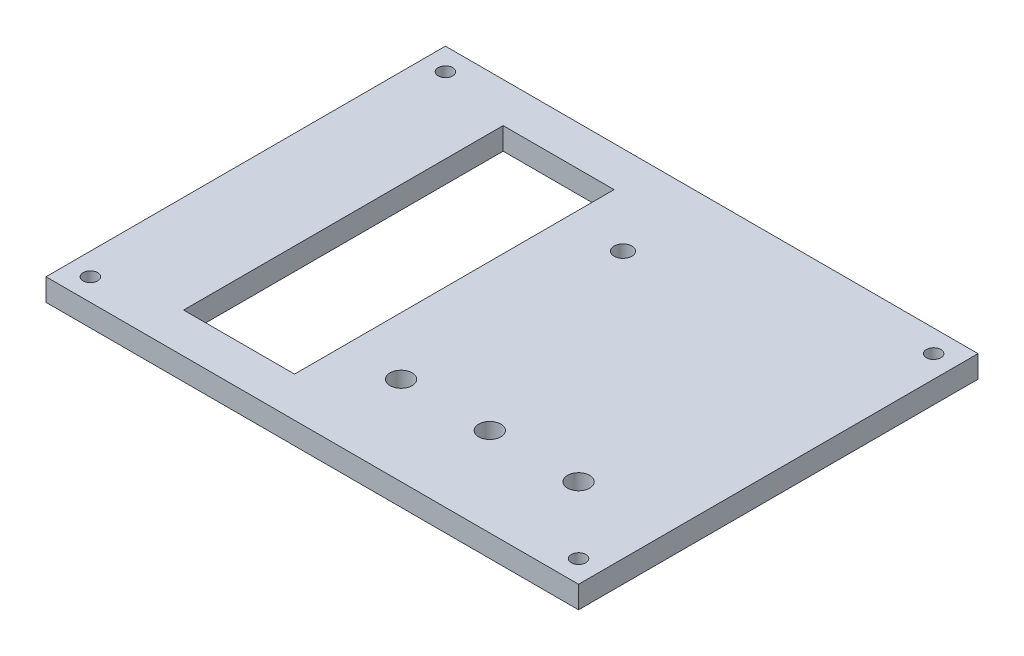
ISO-10303-21;
HEADER;
FILE_DESCRIPTION(('STEP AP214'),'2;1');
FILE_NAME('part.step','',(''),(''),'','','');
FILE_SCHEMA(('AUTOMOTIVE_DESIGN { 1 0 10303 214 1 1 1 1 }'));
ENDSEC;
DATA;
#1=APPLICATION_CONTEXT('core data for automotive mechanical design processes');
#2=APPLICATION_PROTOCOL_DEFINITION('international standard','automotive_design',2000,#1);
#3=PRODUCT_CONTEXT('',#1,'mechanical');
#4=PRODUCT('Part','Part','',(#3));
#5=PRODUCT_RELATED_PRODUCT_CATEGORY('part','',(#4));
#6=PRODUCT_DEFINITION_FORMATION('','',#4);
#7=PRODUCT_DEFINITION_CONTEXT('part definition',#1,'design');
#8=PRODUCT_DEFINITION('design','',#6,#7);
#9=PRODUCT_DEFINITION_SHAPE('','',#8);
#10=(LENGTH_UNIT() NAMED_UNIT(*) SI_UNIT(.MILLI.,.METRE.));
#11=(NAMED_UNIT(*) PLANE_ANGLE_UNIT() SI_UNIT($,.RADIAN.));
#12=(NAMED_UNIT(*) SI_UNIT($,.STERADIAN.) SOLID_ANGLE_UNIT());
#13=UNCERTAINTY_MEASURE_WITH_UNIT(LENGTH_MEASURE(1.E-05),#10,'distance_accuracy_value','');
#14=(GEOMETRIC_REPRESENTATION_CONTEXT(3) GLOBAL_UNCERTAINTY_ASSIGNED_CONTEXT((#13)) GLOBAL_UNIT_ASSIGNED_CONTEXT((#10,
#11,#12)) REPRESENTATION_CONTEXT('',''));
#15=CARTESIAN_POINT('',(0.,0.,0.));
#16=DIRECTION('',(0.,0.,1.));
#17=DIRECTION('',(1.,0.,0.));
#18=AXIS2_PLACEMENT_3D('',#15,#16,#17);
#19=CARTESIAN_POINT('',(60.,5.,45.));
#20=DIRECTION('',(-1.,0.,0.));
#21=DIRECTION('',(0.,0.,1.));
#22=AXIS2_PLACEMENT_3D('',#19,#20,#21);
#23=PLANE('',#22);
#24=DIRECTION('',(0.,0.,-1.));
#25=VECTOR('',#24,1.);
#26=CARTESIAN_POINT('',(60.,0.,45.));
#27=LINE('',#26,#25);
#28=CARTESIAN_POINT('',(60.,0.,45.));
#29=VERTEX_POINT('',#28);
#30=CARTESIAN_POINT('',(60.,0.,-45.));
#31=VERTEX_POINT('',#30);
#32=EDGE_CURVE('E182',#29,#31,#27,.T.);
#33=ORIENTED_EDGE('',*,*,#32,.T.);
#34=DIRECTION('',(0.,-1.,0.));
#35=VECTOR('',#34,1.);
#36=CARTESIAN_POINT('',(60.,5.,-45.));
#37=LINE('',#36,#35);
#38=CARTESIAN_POINT('',(60.,5.,-45.));
#39=VERTEX_POINT('',#38);
#40=EDGE_CURVE('E11',#39,#31,#37,.T.);
#41=ORIENTED_EDGE('',*,*,#40,.F.);
#42=DIRECTION('',(0.,0.,-1.));
#43=VECTOR('',#42,1.);
#44=CARTESIAN_POINT('',(60.,5.,45.));
#45=LINE('',#44,#43);
#46=CARTESIAN_POINT('',(60.,5.,45.));
#47=VERTEX_POINT('',#46);
#48=EDGE_CURVE('E183',#47,#39,#45,.T.);
#49=ORIENTED_EDGE('',*,*,#48,.F.);
#50=DIRECTION('',(0.,-1.,0.));
#51=VECTOR('',#50,1.);
#52=CARTESIAN_POINT('',(60.,5.,45.));
#53=LINE('',#52,#51);
#54=EDGE_CURVE('E193',#47,#29,#53,.T.);
#55=ORIENTED_EDGE('',*,*,#54,.T.);
#56=EDGE_LOOP('',(#33,#41,#49,#55));
#57=FACE_BOUND('',#56,.T.);
#58=ADVANCED_FACE('F35',(#57),#23,.F.);
#59=CARTESIAN_POINT('',(-60.,5.,-45.));
#60=DIRECTION('',(0.,0.,1.));
#61=DIRECTION('',(1.,0.,0.));
#62=AXIS2_PLACEMENT_3D('',#59,#60,#61);
#63=PLANE('',#62);
#64=DIRECTION('',(-1.,0.,0.));
#65=VECTOR('',#64,1.);
#66=CARTESIAN_POINT('',(-60.,0.,-45.));
#67=LINE('',#66,#65);
#68=CARTESIAN_POINT('',(-60.,0.,-45.));
#69=VERTEX_POINT('',#68);
#70=EDGE_CURVE('E196',#31,#69,#67,.T.);
#71=ORIENTED_EDGE('',*,*,#70,.T.);
#72=DIRECTION('',(0.,-1.,0.));
#73=VECTOR('',#72,1.);
#74=CARTESIAN_POINT('',(-60.,5.,-45.));
#75=LINE('',#74,#73);
#76=CARTESIAN_POINT('',(-60.,5.,-45.));
#77=VERTEX_POINT('',#76);
#78=EDGE_CURVE('E42',#77,#69,#75,.T.);
#79=ORIENTED_EDGE('',*,*,#78,.F.);
#80=DIRECTION('',(-1.,0.,0.));
#81=VECTOR('',#80,1.);
#82=CARTESIAN_POINT('',(-60.,5.,-45.));
#83=LINE('',#82,#81);
#84=EDGE_CURVE('E186',#39,#77,#83,.T.);
#85=ORIENTED_EDGE('',*,*,#84,.F.);
#86=ORIENTED_EDGE('',*,*,#40,.T.);
#87=EDGE_LOOP('',(#71,#79,#85,#86));
#88=FACE_BOUND('',#87,.T.);
#89=ADVANCED_FACE('F225',(#88),#63,.F.);
#90=CARTESIAN_POINT('',(-60.,5.,45.));
#91=DIRECTION('',(1.,0.,0.));
#92=DIRECTION('',(0.,0.,-1.));
#93=AXIS2_PLACEMENT_3D('',#90,#91,#92);
#94=PLANE('',#93);
#95=DIRECTION('',(0.,0.,1.));
#96=VECTOR('',#95,1.);
#97=CARTESIAN_POINT('',(-60.,0.,45.));
#98=LINE('',#97,#96);
#99=CARTESIAN_POINT('',(-60.,0.,45.));
#100=VERTEX_POINT('',#99);
#101=EDGE_CURVE('E198',#69,#100,#98,.T.);
#102=ORIENTED_EDGE('',*,*,#101,.T.);
#103=DIRECTION('',(0.,-1.,0.));
#104=VECTOR('',#103,1.);
#105=CARTESIAN_POINT('',(-60.,5.,45.));
#106=LINE('',#105,#104);
#107=CARTESIAN_POINT('',(-60.,5.,45.));
#108=VERTEX_POINT('',#107);
#109=EDGE_CURVE('E203',#108,#100,#106,.T.);
#110=ORIENTED_EDGE('',*,*,#109,.F.);
#111=DIRECTION('',(0.,0.,1.));
#112=VECTOR('',#111,1.);
#113=CARTESIAN_POINT('',(-60.,5.,45.));
#114=LINE('',#113,#112);
#115=EDGE_CURVE('E189',#77,#108,#114,.T.);
#116=ORIENTED_EDGE('',*,*,#115,.F.);
#117=ORIENTED_EDGE('',*,*,#78,.T.);
#118=EDGE_LOOP('',(#102,#110,#116,#117));
#119=FACE_BOUND('',#118,.T.);
#120=ADVANCED_FACE('F210',(#119),#94,.F.);
#121=CARTESIAN_POINT('',(-60.,5.,45.));
#122=DIRECTION('',(0.,0.,-1.));
#123=DIRECTION('',(-1.,0.,0.));
#124=AXIS2_PLACEMENT_3D('',#121,#122,#123);
#125=PLANE('',#124);
#126=DIRECTION('',(1.,0.,0.));
#127=VECTOR('',#126,1.);
#128=CARTESIAN_POINT('',(-60.,0.,45.));
#129=LINE('',#128,#127);
#130=EDGE_CURVE('E187',#100,#29,#129,.T.);
#131=ORIENTED_EDGE('',*,*,#130,.T.);
#132=ORIENTED_EDGE('',*,*,#54,.F.);
#133=DIRECTION('',(1.,0.,0.));
#134=VECTOR('',#133,1.);
#135=CARTESIAN_POINT('',(-60.,5.,45.));
#136=LINE('',#135,#134);
#137=EDGE_CURVE('E191',#108,#47,#136,.T.);
#138=ORIENTED_EDGE('',*,*,#137,.F.);
#139=ORIENTED_EDGE('',*,*,#109,.T.);
#140=EDGE_LOOP('',(#131,#132,#138,#139));
#141=FACE_BOUND('',#140,.T.);
#142=ADVANCED_FACE('F218',(#141),#125,.F.);
#143=CARTESIAN_POINT('',(0.,5.,0.));
#144=DIRECTION('',(0.,-1.,0.));
#145=DIRECTION('',(0.,0.,-1.));
#146=AXIS2_PLACEMENT_3D('',#143,#144,#145);
#147=PLANE('',#146);
#148=CARTESIAN_POINT('',(0.,5.,-25.));
#149=DIRECTION('',(0.,1.,0.));
#150=DIRECTION('',(0.,0.,1.));
#151=AXIS2_PLACEMENT_3D('',#148,#149,#150);
#152=CIRCLE('',#151,2.);
#153=CARTESIAN_POINT('',(0.,5.,-23.));
#154=VERTEX_POINT('',#153);
#155=EDGE_CURVE('E304',#154,#154,#152,.T.);
#156=ORIENTED_EDGE('',*,*,#155,.F.);
#157=EDGE_LOOP('',(#156));
#158=FACE_BOUND('',#157,.T.);
#159=DIRECTION('',(1.,0.,0.));
#160=VECTOR('',#159,1.);
#161=CARTESIAN_POINT('',(-38.,5.,36.));
#162=LINE('',#161,#160);
#163=CARTESIAN_POINT('',(-38.,5.,36.));
#164=VERTEX_POINT('',#163);
#165=CARTESIAN_POINT('',(-13.,5.,36.));
#166=VERTEX_POINT('',#165);
#167=EDGE_CURVE('E129',#164,#166,#162,.T.);
#168=ORIENTED_EDGE('',*,*,#167,.F.);
#169=DIRECTION('',(0.,0.,1.));
#170=VECTOR('',#169,1.);
#171=CARTESIAN_POINT('',(-38.,5.,-36.));
#172=LINE('',#171,#170);
#173=CARTESIAN_POINT('',(-38.,5.,-36.));
#174=VERTEX_POINT('',#173);
#175=EDGE_CURVE('E49',#174,#164,#172,.T.);
#176=ORIENTED_EDGE('',*,*,#175,.F.);
#177=DIRECTION('',(-1.,0.,0.));
#178=VECTOR('',#177,1.);
#179=CARTESIAN_POINT('',(-38.,5.,-36.));
#180=LINE('',#179,#178);
#181=CARTESIAN_POINT('',(-13.,5.,-36.));
#182=VERTEX_POINT('',#181);
#183=EDGE_CURVE('E117',#182,#174,#180,.T.);
#184=ORIENTED_EDGE('',*,*,#183,.F.);
#185=DIRECTION('',(0.,0.,-1.));
#186=VECTOR('',#185,1.);
#187=CARTESIAN_POINT('',(-13.,5.,-36.));
#188=LINE('',#187,#186);
#189=EDGE_CURVE('E120',#166,#182,#188,.T.);
#190=ORIENTED_EDGE('',*,*,#189,.F.);
#191=EDGE_LOOP('',(#168,#176,#184,#190));
#192=FACE_BOUND('',#191,.T.);
#193=CARTESIAN_POINT('',(40.,5.,25.));
#194=DIRECTION('',(0.,1.,0.));
#195=DIRECTION('',(0.,0.,1.));
#196=AXIS2_PLACEMENT_3D('',#193,#194,#195);
#197=CIRCLE('',#196,2.5);
#198=CARTESIAN_POINT('',(40.,5.,27.5));
#199=VERTEX_POINT('',#198);
#200=EDGE_CURVE('E123',#199,#199,#197,.T.);
#201=ORIENTED_EDGE('',*,*,#200,.F.);
#202=EDGE_LOOP('',(#201));
#203=FACE_BOUND('',#202,.T.);
#204=CARTESIAN_POINT('',(20.,5.,25.));
#205=DIRECTION('',(0.,1.,0.));
#206=DIRECTION('',(0.,0.,1.));
#207=AXIS2_PLACEMENT_3D('',#204,#205,#206);
#208=CIRCLE('',#207,2.5);
#209=CARTESIAN_POINT('',(20.,5.,27.5));
#210=VERTEX_POINT('',#209);
#211=EDGE_CURVE('E312',#210,#210,#208,.T.);
#212=ORIENTED_EDGE('',*,*,#211,.F.);
#213=EDGE_LOOP('',(#212));
#214=FACE_BOUND('',#213,.T.);
#215=CARTESIAN_POINT('',(0.,5.,25.));
#216=DIRECTION('',(0.,1.,0.));
#217=DIRECTION('',(0.,0.,1.));
#218=AXIS2_PLACEMENT_3D('',#215,#216,#217);
#219=CIRCLE('',#218,2.5);
#220=CARTESIAN_POINT('',(0.,5.,27.5));
#221=VERTEX_POINT('',#220);
#222=EDGE_CURVE('E143',#221,#221,#219,.T.);
#223=ORIENTED_EDGE('',*,*,#222,.F.);
#224=EDGE_LOOP('',(#223));
#225=FACE_BOUND('',#224,.T.);
#226=CARTESIAN_POINT('',(55.,5.,-40.));
#227=DIRECTION('',(0.,-1.,0.));
#228=DIRECTION('',(0.,0.,-1.));
#229=AXIS2_PLACEMENT_3D('',#226,#227,#228);
#230=CIRCLE('',#229,1.63195);
#231=CARTESIAN_POINT('',(55.,5.,-41.63195));
#232=VERTEX_POINT('',#231);
#233=EDGE_CURVE('E152',#232,#232,#230,.T.);
#234=ORIENTED_EDGE('',*,*,#233,.T.);
#235=EDGE_LOOP('',(#234));
#236=FACE_BOUND('',#235,.T.);
#237=CARTESIAN_POINT('',(55.,5.,40.));
#238=DIRECTION('',(0.,-1.,0.));
#239=DIRECTION('',(0.,0.,-1.));
#240=AXIS2_PLACEMENT_3D('',#237,#238,#239);
#241=CIRCLE('',#240,1.63195);
#242=CARTESIAN_POINT('',(55.,5.,38.36805));
#243=VERTEX_POINT('',#242);
#244=EDGE_CURVE('E161',#243,#243,#241,.T.);
#245=ORIENTED_EDGE('',*,*,#244,.T.);
#246=EDGE_LOOP('',(#245));
#247=FACE_BOUND('',#246,.T.);
#248=CARTESIAN_POINT('',(-55.,5.,40.));
#249=DIRECTION('',(0.,-1.,0.));
#250=DIRECTION('',(0.,0.,-1.));
#251=AXIS2_PLACEMENT_3D('',#248,#249,#250);
#252=CIRCLE('',#251,1.63195);
#253=CARTESIAN_POINT('',(-55.,5.,38.36805));
#254=VERTEX_POINT('',#253);
#255=EDGE_CURVE('E170',#254,#254,#252,.T.);
#256=ORIENTED_EDGE('',*,*,#255,.T.);
#257=EDGE_LOOP('',(#256));
#258=FACE_BOUND('',#257,.T.);
#259=CARTESIAN_POINT('',(-55.,5.,-40.));
#260=DIRECTION('',(0.,-1.,0.));
#261=DIRECTION('',(0.,0.,-1.));
#262=AXIS2_PLACEMENT_3D('',#259,#260,#261);
#263=CIRCLE('',#262,1.63195);
#264=CARTESIAN_POINT('',(-55.,5.,-41.63195));
#265=VERTEX_POINT('',#264);
#266=EDGE_CURVE('E179',#265,#265,#263,.T.);
#267=ORIENTED_EDGE('',*,*,#266,.T.);
#268=EDGE_LOOP('',(#267));
#269=FACE_BOUND('',#268,.T.);
#270=ORIENTED_EDGE('',*,*,#48,.T.);
#271=ORIENTED_EDGE('',*,*,#84,.T.);
#272=ORIENTED_EDGE('',*,*,#115,.T.);
#273=ORIENTED_EDGE('',*,*,#137,.T.);
#274=EDGE_LOOP('',(#270,#271,#272,#273));
#275=FACE_BOUND('',#274,.T.);
#276=ADVANCED_FACE('F224',(#158,#192,#203,#214,#225,#236,#247,#258,#269,#275),#147,.F.);
#277=CARTESIAN_POINT('',(0.,0.,0.));
#278=DIRECTION('',(0.,-1.,0.));
#279=DIRECTION('',(0.,0.,-1.));
#280=AXIS2_PLACEMENT_3D('',#277,#278,#279);
#281=PLANE('',#280);
#282=CARTESIAN_POINT('',(0.,0.,-25.));
#283=DIRECTION('',(0.,-1.,0.));
#284=DIRECTION('',(0.,0.,-1.));
#285=AXIS2_PLACEMENT_3D('',#282,#283,#284);
#286=CIRCLE('',#285,2.);
#287=CARTESIAN_POINT('',(0.,0.,-27.));
#288=VERTEX_POINT('',#287);
#289=EDGE_CURVE('E130',#288,#288,#286,.F.);
#290=ORIENTED_EDGE('',*,*,#289,.T.);
#291=EDGE_LOOP('',(#290));
#292=FACE_BOUND('',#291,.T.);
#293=DIRECTION('',(0.,0.,1.));
#294=VECTOR('',#293,1.);
#295=CARTESIAN_POINT('',(-38.,0.,-36.));
#296=LINE('',#295,#294);
#297=CARTESIAN_POINT('',(-38.,0.,-36.));
#298=VERTEX_POINT('',#297);
#299=CARTESIAN_POINT('',(-38.,0.,36.));
#300=VERTEX_POINT('',#299);
#301=EDGE_CURVE('E101',#298,#300,#296,.T.);
#302=ORIENTED_EDGE('',*,*,#301,.T.);
#303=DIRECTION('',(1.,0.,0.));
#304=VECTOR('',#303,1.);
#305=CARTESIAN_POINT('',(-38.,0.,36.));
#306=LINE('',#305,#304);
#307=CARTESIAN_POINT('',(-13.,0.,36.));
#308=VERTEX_POINT('',#307);
#309=EDGE_CURVE('E110',#300,#308,#306,.T.);
#310=ORIENTED_EDGE('',*,*,#309,.T.);
#311=DIRECTION('',(0.,0.,-1.));
#312=VECTOR('',#311,1.);
#313=CARTESIAN_POINT('',(-13.,0.,-36.));
#314=LINE('',#313,#312);
#315=CARTESIAN_POINT('',(-13.,0.,-36.));
#316=VERTEX_POINT('',#315);
#317=EDGE_CURVE('E57',#308,#316,#314,.T.);
#318=ORIENTED_EDGE('',*,*,#317,.T.);
#319=DIRECTION('',(-1.,0.,0.));
#320=VECTOR('',#319,1.);
#321=CARTESIAN_POINT('',(-38.,0.,-36.));
#322=LINE('',#321,#320);
#323=EDGE_CURVE('E107',#316,#298,#322,.T.);
#324=ORIENTED_EDGE('',*,*,#323,.T.);
#325=EDGE_LOOP('',(#302,#310,#318,#324));
#326=FACE_BOUND('',#325,.T.);
#327=CARTESIAN_POINT('',(40.,0.,25.));
#328=DIRECTION('',(0.,1.,0.));
#329=DIRECTION('',(0.,0.,1.));
#330=AXIS2_PLACEMENT_3D('',#327,#328,#329);
#331=CIRCLE('',#330,2.5);
#332=CARTESIAN_POINT('',(40.,0.,27.5));
#333=VERTEX_POINT('',#332);
#334=EDGE_CURVE('E314',#333,#333,#331,.T.);
#335=ORIENTED_EDGE('',*,*,#334,.T.);
#336=EDGE_LOOP('',(#335));
#337=FACE_BOUND('',#336,.T.);
#338=CARTESIAN_POINT('',(20.,0.,25.));
#339=DIRECTION('',(0.,1.,0.));
#340=DIRECTION('',(0.,0.,1.));
#341=AXIS2_PLACEMENT_3D('',#338,#339,#340);
#342=CIRCLE('',#341,2.5);
#343=CARTESIAN_POINT('',(20.,0.,27.5));
#344=VERTEX_POINT('',#343);
#345=EDGE_CURVE('E146',#344,#344,#342,.T.);
#346=ORIENTED_EDGE('',*,*,#345,.T.);
#347=EDGE_LOOP('',(#346));
#348=FACE_BOUND('',#347,.T.);
#349=CARTESIAN_POINT('',(0.,0.,25.));
#350=DIRECTION('',(0.,1.,0.));
#351=DIRECTION('',(0.,0.,1.));
#352=AXIS2_PLACEMENT_3D('',#349,#350,#351);
#353=CIRCLE('',#352,2.5);
#354=CARTESIAN_POINT('',(0.,0.,27.5));
#355=VERTEX_POINT('',#354);
#356=EDGE_CURVE('E139',#355,#355,#353,.T.);
#357=ORIENTED_EDGE('',*,*,#356,.T.);
#358=EDGE_LOOP('',(#357));
#359=FACE_BOUND('',#358,.T.);
#360=CARTESIAN_POINT('',(55.,0.,-40.));
#361=DIRECTION('',(0.,-1.,0.));
#362=DIRECTION('',(0.,0.,-1.));
#363=AXIS2_PLACEMENT_3D('',#360,#361,#362);
#364=CIRCLE('',#363,2.8575);
#365=CARTESIAN_POINT('',(55.,0.,-42.8575));
#366=VERTEX_POINT('',#365);
#367=EDGE_CURVE('E142',#366,#366,#364,.T.);
#368=ORIENTED_EDGE('',*,*,#367,.F.);
#369=EDGE_LOOP('',(#368));
#370=FACE_BOUND('',#369,.T.);
#371=CARTESIAN_POINT('',(55.,0.,40.));
#372=DIRECTION('',(0.,-1.,0.));
#373=DIRECTION('',(0.,0.,-1.));
#374=AXIS2_PLACEMENT_3D('',#371,#372,#373);
#375=CIRCLE('',#374,2.8575);
#376=CARTESIAN_POINT('',(55.,0.,37.1425));
#377=VERTEX_POINT('',#376);
#378=EDGE_CURVE('E155',#377,#377,#375,.T.);
#379=ORIENTED_EDGE('',*,*,#378,.F.);
#380=EDGE_LOOP('',(#379));
#381=FACE_BOUND('',#380,.T.);
#382=CARTESIAN_POINT('',(-55.,0.,40.));
#383=DIRECTION('',(0.,-1.,0.));
#384=DIRECTION('',(0.,0.,-1.));
#385=AXIS2_PLACEMENT_3D('',#382,#383,#384);
#386=CIRCLE('',#385,2.8575);
#387=CARTESIAN_POINT('',(-55.,0.,37.1425));
#388=VERTEX_POINT('',#387);
#389=EDGE_CURVE('E164',#388,#388,#386,.T.);
#390=ORIENTED_EDGE('',*,*,#389,.F.);
#391=EDGE_LOOP('',(#390));
#392=FACE_BOUND('',#391,.T.);
#393=CARTESIAN_POINT('',(-55.,0.,-40.));
#394=DIRECTION('',(0.,-1.,0.));
#395=DIRECTION('',(0.,0.,-1.));
#396=AXIS2_PLACEMENT_3D('',#393,#394,#395);
#397=CIRCLE('',#396,2.8575);
#398=CARTESIAN_POINT('',(-55.,0.,-42.8575));
#399=VERTEX_POINT('',#398);
#400=EDGE_CURVE('E173',#399,#399,#397,.T.);
#401=ORIENTED_EDGE('',*,*,#400,.F.);
#402=EDGE_LOOP('',(#401));
#403=FACE_BOUND('',#402,.T.);
#404=ORIENTED_EDGE('',*,*,#32,.F.);
#405=ORIENTED_EDGE('',*,*,#130,.F.);
#406=ORIENTED_EDGE('',*,*,#101,.F.);
#407=ORIENTED_EDGE('',*,*,#70,.F.);
#408=EDGE_LOOP('',(#404,#405,#406,#407));
#409=FACE_BOUND('',#408,.T.);
#410=ADVANCED_FACE('F114',(#292,#326,#337,#348,#359,#370,#381,#392,#403,#409),#281,.T.);
#411=CARTESIAN_POINT('',(-55.,0.,-40.));
#412=DIRECTION('',(0.,-1.,0.));
#413=DIRECTION('',(0.,0.,-1.));
#414=AXIS2_PLACEMENT_3D('',#411,#412,#413);
#415=CYLINDRICAL_SURFACE('',#414,1.63195);
#416=ORIENTED_EDGE('',*,*,#266,.F.);
#417=EDGE_LOOP('',(#416));
#418=FACE_BOUND('',#417,.T.);
#419=CARTESIAN_POINT('',(-55.,1.40983400146971,-40.));
#420=DIRECTION('',(0.,-1.,0.));
#421=DIRECTION('',(0.,0.,-1.));
#422=AXIS2_PLACEMENT_3D('',#419,#420,#421);
#423=CIRCLE('',#422,1.63195);
#424=CARTESIAN_POINT('',(-55.,1.40983400146971,-41.63195));
#425=VERTEX_POINT('',#424);
#426=EDGE_CURVE('E176',#425,#425,#423,.T.);
#427=ORIENTED_EDGE('',*,*,#426,.T.);
#428=EDGE_LOOP('',(#427));
#429=FACE_BOUND('',#428,.T.);
#430=ADVANCED_FACE('F237',(#418,#429),#415,.F.);
#431=CARTESIAN_POINT('',(-55.,0.,-40.));
#432=DIRECTION('',(0.,-1.,0.));
#433=DIRECTION('',(0.,0.,-1.));
#434=AXIS2_PLACEMENT_3D('',#431,#432,#433);
#435=CONICAL_SURFACE('',#434,2.8575,0.715584993317673);
#436=ORIENTED_EDGE('',*,*,#426,.F.);
#437=EDGE_LOOP('',(#436));
#438=FACE_BOUND('',#437,.T.);
#439=ORIENTED_EDGE('',*,*,#400,.T.);
#440=EDGE_LOOP('',(#439));
#441=FACE_BOUND('',#440,.T.);
#442=ADVANCED_FACE('F244',(#438,#441),#435,.F.);
#443=CARTESIAN_POINT('',(-55.,0.,40.));
#444=DIRECTION('',(0.,-1.,0.));
#445=DIRECTION('',(0.,0.,-1.));
#446=AXIS2_PLACEMENT_3D('',#443,#444,#445);
#447=CYLINDRICAL_SURFACE('',#446,1.63195);
#448=ORIENTED_EDGE('',*,*,#255,.F.);
#449=EDGE_LOOP('',(#448));
#450=FACE_BOUND('',#449,.T.);
#451=CARTESIAN_POINT('',(-55.,1.40983400146971,40.));
#452=DIRECTION('',(0.,-1.,0.));
#453=DIRECTION('',(0.,0.,-1.));
#454=AXIS2_PLACEMENT_3D('',#451,#452,#453);
#455=CIRCLE('',#454,1.63195);
#456=CARTESIAN_POINT('',(-55.,1.40983400146971,38.36805));
#457=VERTEX_POINT('',#456);
#458=EDGE_CURVE('E167',#457,#457,#455,.T.);
#459=ORIENTED_EDGE('',*,*,#458,.T.);
#460=EDGE_LOOP('',(#459));
#461=FACE_BOUND('',#460,.T.);
#462=ADVANCED_FACE('F248',(#450,#461),#447,.F.);
#463=CARTESIAN_POINT('',(-55.,0.,40.));
#464=DIRECTION('',(0.,-1.,0.));
#465=DIRECTION('',(0.,0.,-1.));
#466=AXIS2_PLACEMENT_3D('',#463,#464,#465);
#467=CONICAL_SURFACE('',#466,2.8575,0.715584993317673);
#468=ORIENTED_EDGE('',*,*,#458,.F.);
#469=EDGE_LOOP('',(#468));
#470=FACE_BOUND('',#469,.T.);
#471=ORIENTED_EDGE('',*,*,#389,.T.);
#472=EDGE_LOOP('',(#471));
#473=FACE_BOUND('',#472,.T.);
#474=ADVANCED_FACE('F252',(#470,#473),#467,.F.);
#475=CARTESIAN_POINT('',(55.,0.,40.));
#476=DIRECTION('',(0.,-1.,0.));
#477=DIRECTION('',(0.,0.,-1.));
#478=AXIS2_PLACEMENT_3D('',#475,#476,#477);
#479=CYLINDRICAL_SURFACE('',#478,1.63195);
#480=ORIENTED_EDGE('',*,*,#244,.F.);
#481=EDGE_LOOP('',(#480));
#482=FACE_BOUND('',#481,.T.);
#483=CARTESIAN_POINT('',(55.,1.40983400146971,40.));
#484=DIRECTION('',(0.,-1.,0.));
#485=DIRECTION('',(0.,0.,-1.));
#486=AXIS2_PLACEMENT_3D('',#483,#484,#485);
#487=CIRCLE('',#486,1.63195);
#488=CARTESIAN_POINT('',(55.,1.40983400146971,38.36805));
#489=VERTEX_POINT('',#488);
#490=EDGE_CURVE('E158',#489,#489,#487,.T.);
#491=ORIENTED_EDGE('',*,*,#490,.T.);
#492=EDGE_LOOP('',(#491));
#493=FACE_BOUND('',#492,.T.);
#494=ADVANCED_FACE('F256',(#482,#493),#479,.F.);
#495=CARTESIAN_POINT('',(55.,0.,40.));
#496=DIRECTION('',(0.,-1.,0.));
#497=DIRECTION('',(0.,0.,-1.));
#498=AXIS2_PLACEMENT_3D('',#495,#496,#497);
#499=CONICAL_SURFACE('',#498,2.8575,0.715584993317673);
#500=ORIENTED_EDGE('',*,*,#490,.F.);
#501=EDGE_LOOP('',(#500));
#502=FACE_BOUND('',#501,.T.);
#503=ORIENTED_EDGE('',*,*,#378,.T.);
#504=EDGE_LOOP('',(#503));
#505=FACE_BOUND('',#504,.T.);
#506=ADVANCED_FACE('F260',(#502,#505),#499,.F.);
#507=CARTESIAN_POINT('',(55.,0.,-40.));
#508=DIRECTION('',(0.,-1.,0.));
#509=DIRECTION('',(0.,0.,-1.));
#510=AXIS2_PLACEMENT_3D('',#507,#508,#509);
#511=CYLINDRICAL_SURFACE('',#510,1.63195);
#512=ORIENTED_EDGE('',*,*,#233,.F.);
#513=EDGE_LOOP('',(#512));
#514=FACE_BOUND('',#513,.T.);
#515=CARTESIAN_POINT('',(55.,1.40983400146971,-40.));
#516=DIRECTION('',(0.,-1.,0.));
#517=DIRECTION('',(0.,0.,-1.));
#518=AXIS2_PLACEMENT_3D('',#515,#516,#517);
#519=CIRCLE('',#518,1.63195);
#520=CARTESIAN_POINT('',(55.,1.40983400146971,-41.63195));
#521=VERTEX_POINT('',#520);
#522=EDGE_CURVE('E149',#521,#521,#519,.T.);
#523=ORIENTED_EDGE('',*,*,#522,.T.);
#524=EDGE_LOOP('',(#523));
#525=FACE_BOUND('',#524,.T.);
#526=ADVANCED_FACE('F264',(#514,#525),#511,.F.);
#527=CARTESIAN_POINT('',(55.,0.,-40.));
#528=DIRECTION('',(0.,-1.,0.));
#529=DIRECTION('',(0.,0.,-1.));
#530=AXIS2_PLACEMENT_3D('',#527,#528,#529);
#531=CONICAL_SURFACE('',#530,2.8575,0.715584993317673);
#532=ORIENTED_EDGE('',*,*,#522,.F.);
#533=EDGE_LOOP('',(#532));
#534=FACE_BOUND('',#533,.T.);
#535=ORIENTED_EDGE('',*,*,#367,.T.);
#536=EDGE_LOOP('',(#535));
#537=FACE_BOUND('',#536,.T.);
#538=ADVANCED_FACE('F268',(#534,#537),#531,.F.);
#539=CARTESIAN_POINT('',(0.,0.,25.));
#540=DIRECTION('',(0.,1.,0.));
#541=DIRECTION('',(0.,0.,1.));
#542=AXIS2_PLACEMENT_3D('',#539,#540,#541);
#543=CYLINDRICAL_SURFACE('',#542,2.5);
#544=ORIENTED_EDGE('',*,*,#356,.F.);
#545=EDGE_LOOP('',(#544));
#546=FACE_BOUND('',#545,.T.);
#547=ORIENTED_EDGE('',*,*,#222,.T.);
#548=EDGE_LOOP('',(#547));
#549=FACE_BOUND('',#548,.T.);
#550=ADVANCED_FACE('F272',(#546,#549),#543,.F.);
#551=CARTESIAN_POINT('',(20.,0.,25.));
#552=DIRECTION('',(0.,1.,0.));
#553=DIRECTION('',(0.,0.,1.));
#554=AXIS2_PLACEMENT_3D('',#551,#552,#553);
#555=CYLINDRICAL_SURFACE('',#554,2.5);
#556=ORIENTED_EDGE('',*,*,#345,.F.);
#557=EDGE_LOOP('',(#556));
#558=FACE_BOUND('',#557,.T.);
#559=ORIENTED_EDGE('',*,*,#211,.T.);
#560=EDGE_LOOP('',(#559));
#561=FACE_BOUND('',#560,.T.);
#562=ADVANCED_FACE('F276',(#558,#561),#555,.F.);
#563=CARTESIAN_POINT('',(40.,0.,25.));
#564=DIRECTION('',(0.,1.,0.));
#565=DIRECTION('',(0.,0.,1.));
#566=AXIS2_PLACEMENT_3D('',#563,#564,#565);
#567=CYLINDRICAL_SURFACE('',#566,2.5);
#568=ORIENTED_EDGE('',*,*,#334,.F.);
#569=EDGE_LOOP('',(#568));
#570=FACE_BOUND('',#569,.T.);
#571=ORIENTED_EDGE('',*,*,#200,.T.);
#572=EDGE_LOOP('',(#571));
#573=FACE_BOUND('',#572,.T.);
#574=ADVANCED_FACE('F281',(#570,#573),#567,.F.);
#575=CARTESIAN_POINT('',(-38.,0.,-36.));
#576=DIRECTION('',(-1.,0.,0.));
#577=DIRECTION('',(0.,0.,1.));
#578=AXIS2_PLACEMENT_3D('',#575,#576,#577);
#579=PLANE('',#578);
#580=ORIENTED_EDGE('',*,*,#175,.T.);
#581=DIRECTION('',(0.,1.,0.));
#582=VECTOR('',#581,1.);
#583=CARTESIAN_POINT('',(-38.,0.,36.));
#584=LINE('',#583,#582);
#585=EDGE_CURVE('E97',#300,#164,#584,.T.);
#586=ORIENTED_EDGE('',*,*,#585,.F.);
#587=ORIENTED_EDGE('',*,*,#301,.F.);
#588=DIRECTION('',(0.,1.,0.));
#589=VECTOR('',#588,1.);
#590=CARTESIAN_POINT('',(-38.,0.,-36.));
#591=LINE('',#590,#589);
#592=EDGE_CURVE('E134',#298,#174,#591,.T.);
#593=ORIENTED_EDGE('',*,*,#592,.T.);
#594=EDGE_LOOP('',(#580,#586,#587,#593));
#595=FACE_BOUND('',#594,.T.);
#596=ADVANCED_FACE('F99',(#595),#579,.F.);
#597=CARTESIAN_POINT('',(-38.,0.,-36.));
#598=DIRECTION('',(0.,0.,-1.));
#599=DIRECTION('',(-1.,0.,0.));
#600=AXIS2_PLACEMENT_3D('',#597,#598,#599);
#601=PLANE('',#600);
#602=ORIENTED_EDGE('',*,*,#183,.T.);
#603=ORIENTED_EDGE('',*,*,#592,.F.);
#604=ORIENTED_EDGE('',*,*,#323,.F.);
#605=DIRECTION('',(0.,1.,0.));
#606=VECTOR('',#605,1.);
#607=CARTESIAN_POINT('',(-13.,0.,-36.));
#608=LINE('',#607,#606);
#609=EDGE_CURVE('E136',#316,#182,#608,.T.);
#610=ORIENTED_EDGE('',*,*,#609,.T.);
#611=EDGE_LOOP('',(#602,#603,#604,#610));
#612=FACE_BOUND('',#611,.T.);
#613=ADVANCED_FACE('F280',(#612),#601,.F.);
#614=CARTESIAN_POINT('',(-13.,0.,-36.));
#615=DIRECTION('',(1.,0.,0.));
#616=DIRECTION('',(0.,0.,-1.));
#617=AXIS2_PLACEMENT_3D('',#614,#615,#616);
#618=PLANE('',#617);
#619=ORIENTED_EDGE('',*,*,#189,.T.);
#620=ORIENTED_EDGE('',*,*,#609,.F.);
#621=ORIENTED_EDGE('',*,*,#317,.F.);
#622=DIRECTION('',(0.,1.,0.));
#623=VECTOR('',#622,1.);
#624=CARTESIAN_POINT('',(-13.,0.,36.));
#625=LINE('',#624,#623);
#626=EDGE_CURVE('E106',#308,#166,#625,.T.);
#627=ORIENTED_EDGE('',*,*,#626,.T.);
#628=EDGE_LOOP('',(#619,#620,#621,#627));
#629=FACE_BOUND('',#628,.T.);
#630=ADVANCED_FACE('F285',(#629),#618,.F.);
#631=CARTESIAN_POINT('',(-38.,0.,36.));
#632=DIRECTION('',(0.,0.,1.));
#633=DIRECTION('',(1.,0.,0.));
#634=AXIS2_PLACEMENT_3D('',#631,#632,#633);
#635=PLANE('',#634);
#636=ORIENTED_EDGE('',*,*,#167,.T.);
#637=ORIENTED_EDGE('',*,*,#626,.F.);
#638=ORIENTED_EDGE('',*,*,#309,.F.);
#639=ORIENTED_EDGE('',*,*,#585,.T.);
#640=EDGE_LOOP('',(#636,#637,#638,#639));
#641=FACE_BOUND('',#640,.T.);
#642=ADVANCED_FACE('F111',(#641),#635,.F.);
#643=CARTESIAN_POINT('',(0.,-5.65685424949239,-25.));
#644=DIRECTION('',(0.,1.,0.));
#645=DIRECTION('',(0.,0.,1.));
#646=AXIS2_PLACEMENT_3D('',#643,#644,#645);
#647=CYLINDRICAL_SURFACE('',#646,2.);
#648=ORIENTED_EDGE('',*,*,#155,.T.);
#649=EDGE_LOOP('',(#648));
#650=FACE_BOUND('',#649,.T.);
#651=ORIENTED_EDGE('',*,*,#289,.F.);
#652=EDGE_LOOP('',(#651));
#653=FACE_BOUND('',#652,.T.);
#654=ADVANCED_FACE('F284',(#650,#653),#647,.F.);
#655=CLOSED_SHELL('',(#58,#89,#120,#142,#276,#410,#430,#442,#462,#474,#494,#506,#526,#538,#550,
#562,#574,#596,#613,#630,#642,#654));
#656=MANIFOLD_SOLID_BREP('B2',#655);
#657=ADVANCED_BREP_SHAPE_REPRESENTATION('',(#18,#656),#14);
#658=SHAPE_DEFINITION_REPRESENTATION(#9,#657);
ENDSEC;
END-ISO-10303-21;
